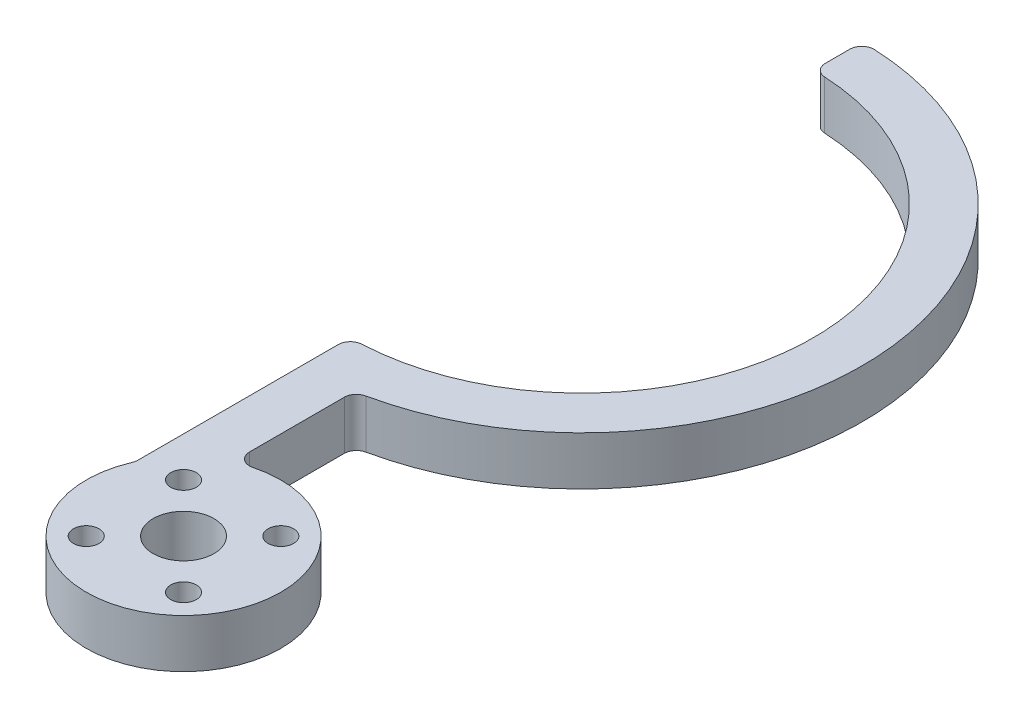
ISO-10303-21;
HEADER;
FILE_DESCRIPTION(('STEP AP214'),'2;1');
FILE_NAME('part.step','',(''),(''),'','','');
FILE_SCHEMA(('AUTOMOTIVE_DESIGN { 1 0 10303 214 1 1 1 1 }'));
ENDSEC;
DATA;
#1=APPLICATION_CONTEXT('core data for automotive mechanical design processes');
#2=APPLICATION_PROTOCOL_DEFINITION('international standard','automotive_design',2000,#1);
#3=PRODUCT_CONTEXT('',#1,'mechanical');
#4=PRODUCT('Part','Part','',(#3));
#5=PRODUCT_RELATED_PRODUCT_CATEGORY('part','',(#4));
#6=PRODUCT_DEFINITION_FORMATION('','',#4);
#7=PRODUCT_DEFINITION_CONTEXT('part definition',#1,'design');
#8=PRODUCT_DEFINITION('design','',#6,#7);
#9=PRODUCT_DEFINITION_SHAPE('','',#8);
#10=(LENGTH_UNIT() NAMED_UNIT(*) SI_UNIT(.MILLI.,.METRE.));
#11=(NAMED_UNIT(*) PLANE_ANGLE_UNIT() SI_UNIT($,.RADIAN.));
#12=(NAMED_UNIT(*) SI_UNIT($,.STERADIAN.) SOLID_ANGLE_UNIT());
#13=UNCERTAINTY_MEASURE_WITH_UNIT(LENGTH_MEASURE(1.E-05),#10,'distance_accuracy_value','');
#14=(GEOMETRIC_REPRESENTATION_CONTEXT(3) GLOBAL_UNCERTAINTY_ASSIGNED_CONTEXT((#13)) GLOBAL_UNIT_ASSIGNED_CONTEXT((#10,
#11,#12)) REPRESENTATION_CONTEXT('',''));
#15=CARTESIAN_POINT('',(0.,0.,0.));
#16=DIRECTION('',(0.,0.,1.));
#17=DIRECTION('',(1.,0.,0.));
#18=AXIS2_PLACEMENT_3D('',#15,#16,#17);
#19=CARTESIAN_POINT('',(0.,8.,0.));
#20=DIRECTION('',(1.,0.,0.));
#21=DIRECTION('',(0.,0.,-1.));
#22=AXIS2_PLACEMENT_3D('',#19,#20,#21);
#23=PLANE('',#22);
#24=DIRECTION('',(0.,0.,1.));
#25=VECTOR('',#24,1.);
#26=CARTESIAN_POINT('',(0.,0.,0.));
#27=LINE('',#26,#25);
#28=CARTESIAN_POINT('',(0.,0.,40.0500936328494));
#29=VERTEX_POINT('',#28);
#30=CARTESIAN_POINT('',(0.,0.,72.9797162674329));
#31=VERTEX_POINT('',#30);
#32=EDGE_CURVE('E220',#29,#31,#27,.T.);
#33=ORIENTED_EDGE('',*,*,#32,.T.);
#34=DIRECTION('',(0.,1.,0.));
#35=VECTOR('',#34,1.);
#36=CARTESIAN_POINT('',(0.,8.,72.9797162674329));
#37=LINE('',#36,#35);
#38=CARTESIAN_POINT('',(0.,8.,72.9797162674329));
#39=VERTEX_POINT('',#38);
#40=EDGE_CURVE('E166',#31,#39,#37,.T.);
#41=ORIENTED_EDGE('',*,*,#40,.T.);
#42=DIRECTION('',(0.,0.,1.));
#43=VECTOR('',#42,1.);
#44=CARTESIAN_POINT('',(0.,8.,0.));
#45=LINE('',#44,#43);
#46=CARTESIAN_POINT('',(0.,8.,40.0500936328494));
#47=VERTEX_POINT('',#46);
#48=EDGE_CURVE('E207',#47,#39,#45,.T.);
#49=ORIENTED_EDGE('',*,*,#48,.F.);
#50=DIRECTION('',(0.,1.,0.));
#51=VECTOR('',#50,1.);
#52=CARTESIAN_POINT('',(0.,0.,40.0500936328494));
#53=LINE('',#52,#51);
#54=EDGE_CURVE('E163',#47,#29,#53,.F.);
#55=ORIENTED_EDGE('',*,*,#54,.T.);
#56=EDGE_LOOP('',(#33,#41,#49,#55));
#57=FACE_BOUND('',#56,.T.);
#58=ADVANCED_FACE('F35',(#57),#23,.F.);
#59=CARTESIAN_POINT('',(14.5597646330328,8.,80.0347992080196));
#60=DIRECTION('',(0.,-1.,0.));
#61=DIRECTION('',(0.,0.,-1.));
#62=AXIS2_PLACEMENT_3D('',#59,#60,#61);
#63=CYLINDRICAL_SURFACE('',#62,16.);
#64=CARTESIAN_POINT('',(14.5597646330328,0.,80.0347992080196));
#65=DIRECTION('',(0.,1.,0.));
#66=DIRECTION('',(0.,0.,1.));
#67=AXIS2_PLACEMENT_3D('',#64,#65,#66);
#68=CIRCLE('',#67,16.);
#69=CARTESIAN_POINT('',(-0.160026151885258,0.,73.7636143719426));
#70=VERTEX_POINT('',#69);
#71=CARTESIAN_POINT('',(10.5066405147814,0.,64.5566796555013));
#72=VERTEX_POINT('',#71);
#73=EDGE_CURVE('E144',#70,#72,#68,.T.);
#74=ORIENTED_EDGE('',*,*,#73,.T.);
#75=DIRECTION('',(0.,-1.,0.));
#76=VECTOR('',#75,1.);
#77=CARTESIAN_POINT('',(10.5066405147814,8.,64.5566796555013));
#78=LINE('',#77,#76);
#79=CARTESIAN_POINT('',(10.5066405147814,8.,64.5566796555013));
#80=VERTEX_POINT('',#79);
#81=EDGE_CURVE('E161',#72,#80,#78,.F.);
#82=ORIENTED_EDGE('',*,*,#81,.T.);
#83=CARTESIAN_POINT('',(14.5597646330328,8.,80.0347992080196));
#84=DIRECTION('',(0.,1.,0.));
#85=DIRECTION('',(0.,0.,1.));
#86=AXIS2_PLACEMENT_3D('',#83,#84,#85);
#87=CIRCLE('',#86,16.);
#88=CARTESIAN_POINT('',(-0.160026151885258,8.,73.7636143719426));
#89=VERTEX_POINT('',#88);
#90=EDGE_CURVE('E204',#89,#80,#87,.T.);
#91=ORIENTED_EDGE('',*,*,#90,.F.);
#92=DIRECTION('',(0.,-1.,0.));
#93=VECTOR('',#92,1.);
#94=CARTESIAN_POINT('',(-0.160026151885258,8.,73.7636143719426));
#95=LINE('',#94,#93);
#96=EDGE_CURVE('E150',#89,#70,#95,.T.);
#97=ORIENTED_EDGE('',*,*,#96,.T.);
#98=EDGE_LOOP('',(#74,#82,#91,#97));
#99=FACE_BOUND('',#98,.T.);
#100=ADVANCED_FACE('F213',(#99),#63,.T.);
#101=CARTESIAN_POINT('',(7.99999999999999,8.,0.));
#102=DIRECTION('',(1.,0.,0.));
#103=DIRECTION('',(0.,0.,-1.));
#104=AXIS2_PLACEMENT_3D('',#101,#102,#103);
#105=PLANE('',#104);
#106=DIRECTION('',(0.,0.,1.));
#107=VECTOR('',#106,1.);
#108=CARTESIAN_POINT('',(7.99999999999999,8.,0.));
#109=LINE('',#108,#107);
#110=CARTESIAN_POINT('',(8.,8.,47.0490169929192));
#111=VERTEX_POINT('',#110);
#112=CARTESIAN_POINT('',(8.,8.,62.6219147114365));
#113=VERTEX_POINT('',#112);
#114=EDGE_CURVE('E216',#111,#113,#109,.T.);
#115=ORIENTED_EDGE('',*,*,#114,.T.);
#116=DIRECTION('',(0.,-1.,0.));
#117=VECTOR('',#116,1.);
#118=CARTESIAN_POINT('',(8.,8.,62.6219147114365));
#119=LINE('',#118,#117);
#120=CARTESIAN_POINT('',(8.,0.,62.6219147114365));
#121=VERTEX_POINT('',#120);
#122=EDGE_CURVE('E143',#113,#121,#119,.T.);
#123=ORIENTED_EDGE('',*,*,#122,.T.);
#124=DIRECTION('',(0.,0.,1.));
#125=VECTOR('',#124,1.);
#126=CARTESIAN_POINT('',(7.99999999999999,0.,0.));
#127=LINE('',#126,#125);
#128=CARTESIAN_POINT('',(8.,0.,47.0490169929192));
#129=VERTEX_POINT('',#128);
#130=EDGE_CURVE('E128',#129,#121,#127,.T.);
#131=ORIENTED_EDGE('',*,*,#130,.F.);
#132=DIRECTION('',(0.,-1.,0.));
#133=VECTOR('',#132,1.);
#134=CARTESIAN_POINT('',(8.,8.,47.0490169929192));
#135=LINE('',#134,#133);
#136=EDGE_CURVE('E140',#129,#111,#135,.F.);
#137=ORIENTED_EDGE('',*,*,#136,.T.);
#138=EDGE_LOOP('',(#115,#123,#131,#137));
#139=FACE_BOUND('',#138,.T.);
#140=ADVANCED_FACE('F139',(#139),#105,.T.);
#141=CARTESIAN_POINT('',(0.,8.,0.));
#142=DIRECTION('',(0.,-1.,0.));
#143=DIRECTION('',(0.,0.,-1.));
#144=AXIS2_PLACEMENT_3D('',#141,#142,#143);
#145=CYLINDRICAL_SURFACE('',#144,46.1);
#146=CARTESIAN_POINT('',(0.,8.,0.));
#147=DIRECTION('',(0.,1.,0.));
#148=DIRECTION('',(0.,0.,1.));
#149=AXIS2_PLACEMENT_3D('',#146,#147,#148);
#150=CIRCLE('',#149,46.1);
#151=CARTESIAN_POINT('',(9.58419958419958,8.,45.0927169100535));
#152=VERTEX_POINT('',#151);
#153=CARTESIAN_POINT('',(2.09070294784575,8.,-46.0525673679966));
#154=VERTEX_POINT('',#153);
#155=EDGE_CURVE('E255',#152,#154,#150,.T.);
#156=ORIENTED_EDGE('',*,*,#155,.F.);
#157=DIRECTION('',(0.,-1.,0.));
#158=VECTOR('',#157,1.);
#159=CARTESIAN_POINT('',(9.58419958419958,8.,45.0927169100535));
#160=LINE('',#159,#158);
#161=CARTESIAN_POINT('',(9.58419958419958,0.,45.0927169100535));
#162=VERTEX_POINT('',#161);
#163=EDGE_CURVE('E186',#152,#162,#160,.T.);
#164=ORIENTED_EDGE('',*,*,#163,.T.);
#165=CARTESIAN_POINT('',(0.,0.,0.));
#166=DIRECTION('',(0.,1.,0.));
#167=DIRECTION('',(0.,0.,1.));
#168=AXIS2_PLACEMENT_3D('',#165,#166,#167);
#169=CIRCLE('',#168,46.1);
#170=CARTESIAN_POINT('',(2.09070294784575,0.,-46.0525673679966));
#171=VERTEX_POINT('',#170);
#172=EDGE_CURVE('E130',#162,#171,#169,.T.);
#173=ORIENTED_EDGE('',*,*,#172,.T.);
#174=DIRECTION('',(0.,-1.,0.));
#175=VECTOR('',#174,1.);
#176=CARTESIAN_POINT('',(2.09070294784575,8.,-46.0525673679967));
#177=LINE('',#176,#175);
#178=EDGE_CURVE('E184',#171,#154,#177,.F.);
#179=ORIENTED_EDGE('',*,*,#178,.T.);
#180=EDGE_LOOP('',(#156,#164,#173,#179));
#181=FACE_BOUND('',#180,.T.);
#182=ADVANCED_FACE('F296',(#181),#145,.T.);
#183=CARTESIAN_POINT('',(0.,8.,0.));
#184=DIRECTION('',(1.,0.,0.));
#185=DIRECTION('',(0.,0.,-1.));
#186=AXIS2_PLACEMENT_3D('',#183,#184,#185);
#187=PLANE('',#186);
#188=DIRECTION('',(0.,0.,1.));
#189=VECTOR('',#188,1.);
#190=CARTESIAN_POINT('',(0.,0.,0.));
#191=LINE('',#190,#189);
#192=CARTESIAN_POINT('',(0.,0.,-44.0546251828341));
#193=VERTEX_POINT('',#192);
#194=CARTESIAN_POINT('',(0.,0.,-40.0500936328494));
#195=VERTEX_POINT('',#194);
#196=EDGE_CURVE('E231',#193,#195,#191,.T.);
#197=ORIENTED_EDGE('',*,*,#196,.T.);
#198=DIRECTION('',(0.,1.,0.));
#199=VECTOR('',#198,1.);
#200=CARTESIAN_POINT('',(0.,8.,-40.0500936328494));
#201=LINE('',#200,#199);
#202=CARTESIAN_POINT('',(0.,8.,-40.0500936328494));
#203=VERTEX_POINT('',#202);
#204=EDGE_CURVE('E50',#195,#203,#201,.T.);
#205=ORIENTED_EDGE('',*,*,#204,.T.);
#206=DIRECTION('',(0.,0.,1.));
#207=VECTOR('',#206,1.);
#208=CARTESIAN_POINT('',(0.,8.,0.));
#209=LINE('',#208,#207);
#210=CARTESIAN_POINT('',(0.,8.,-44.0546251828341));
#211=VERTEX_POINT('',#210);
#212=EDGE_CURVE('E153',#211,#203,#209,.T.);
#213=ORIENTED_EDGE('',*,*,#212,.F.);
#214=DIRECTION('',(0.,-1.,0.));
#215=VECTOR('',#214,1.);
#216=CARTESIAN_POINT('',(0.,8.,-44.0546251828341));
#217=LINE('',#216,#215);
#218=EDGE_CURVE('E188',#211,#193,#217,.T.);
#219=ORIENTED_EDGE('',*,*,#218,.T.);
#220=EDGE_LOOP('',(#197,#205,#213,#219));
#221=FACE_BOUND('',#220,.T.);
#222=ADVANCED_FACE('F284',(#221),#187,.F.);
#223=CARTESIAN_POINT('',(22.5597646330328,8.,72.0347992080196));
#224=DIRECTION('',(0.,-1.,0.));
#225=DIRECTION('',(0.,0.,-1.));
#226=AXIS2_PLACEMENT_3D('',#223,#224,#225);
#227=CYLINDRICAL_SURFACE('',#226,2.1);
#228=CARTESIAN_POINT('',(22.5597646330328,8.,72.0347992080196));
#229=DIRECTION('',(0.,1.,0.));
#230=DIRECTION('',(0.,0.,1.));
#231=AXIS2_PLACEMENT_3D('',#228,#229,#230);
#232=CIRCLE('',#231,2.1);
#233=CARTESIAN_POINT('',(22.5597646330328,8.,74.1347992080196));
#234=VERTEX_POINT('',#233);
#235=EDGE_CURVE('E250',#234,#234,#232,.T.);
#236=ORIENTED_EDGE('',*,*,#235,.T.);
#237=EDGE_LOOP('',(#236));
#238=FACE_BOUND('',#237,.T.);
#239=CARTESIAN_POINT('',(22.5597646330328,0.,72.0347992080196));
#240=DIRECTION('',(0.,1.,0.));
#241=DIRECTION('',(0.,0.,1.));
#242=AXIS2_PLACEMENT_3D('',#239,#240,#241);
#243=CIRCLE('',#242,2.1);
#244=CARTESIAN_POINT('',(22.5597646330328,0.,74.1347992080196));
#245=VERTEX_POINT('',#244);
#246=EDGE_CURVE('E223',#245,#245,#243,.T.);
#247=ORIENTED_EDGE('',*,*,#246,.F.);
#248=EDGE_LOOP('',(#247));
#249=FACE_BOUND('',#248,.T.);
#250=ADVANCED_FACE('F274',(#238,#249),#227,.F.);
#251=CARTESIAN_POINT('',(22.5597646330328,8.,88.0347992080196));
#252=DIRECTION('',(0.,-1.,0.));
#253=DIRECTION('',(0.,0.,-1.));
#254=AXIS2_PLACEMENT_3D('',#251,#252,#253);
#255=CYLINDRICAL_SURFACE('',#254,2.1);
#256=CARTESIAN_POINT('',(22.5597646330328,8.,88.0347992080196));
#257=DIRECTION('',(0.,1.,0.));
#258=DIRECTION('',(0.,0.,1.));
#259=AXIS2_PLACEMENT_3D('',#256,#257,#258);
#260=CIRCLE('',#259,2.1);
#261=CARTESIAN_POINT('',(22.5597646330328,8.,90.1347992080196));
#262=VERTEX_POINT('',#261);
#263=EDGE_CURVE('E247',#262,#262,#260,.T.);
#264=ORIENTED_EDGE('',*,*,#263,.T.);
#265=EDGE_LOOP('',(#264));
#266=FACE_BOUND('',#265,.T.);
#267=CARTESIAN_POINT('',(22.5597646330328,0.,88.0347992080196));
#268=DIRECTION('',(0.,1.,0.));
#269=DIRECTION('',(0.,0.,1.));
#270=AXIS2_PLACEMENT_3D('',#267,#268,#269);
#271=CIRCLE('',#270,2.1);
#272=CARTESIAN_POINT('',(22.5597646330328,0.,90.1347992080196));
#273=VERTEX_POINT('',#272);
#274=EDGE_CURVE('E227',#273,#273,#271,.T.);
#275=ORIENTED_EDGE('',*,*,#274,.F.);
#276=EDGE_LOOP('',(#275));
#277=FACE_BOUND('',#276,.T.);
#278=ADVANCED_FACE('F271',(#266,#277),#255,.F.);
#279=CARTESIAN_POINT('',(6.55976463303278,8.,88.0347992080196));
#280=DIRECTION('',(0.,-1.,0.));
#281=DIRECTION('',(0.,0.,-1.));
#282=AXIS2_PLACEMENT_3D('',#279,#280,#281);
#283=CYLINDRICAL_SURFACE('',#282,2.1);
#284=CARTESIAN_POINT('',(6.55976463303278,8.,88.0347992080196));
#285=DIRECTION('',(0.,1.,0.));
#286=DIRECTION('',(0.,0.,1.));
#287=AXIS2_PLACEMENT_3D('',#284,#285,#286);
#288=CIRCLE('',#287,2.1);
#289=CARTESIAN_POINT('',(6.55976463303278,8.,90.1347992080196));
#290=VERTEX_POINT('',#289);
#291=EDGE_CURVE('E242',#290,#290,#288,.T.);
#292=ORIENTED_EDGE('',*,*,#291,.T.);
#293=EDGE_LOOP('',(#292));
#294=FACE_BOUND('',#293,.T.);
#295=CARTESIAN_POINT('',(6.55976463303278,0.,88.0347992080196));
#296=DIRECTION('',(0.,1.,0.));
#297=DIRECTION('',(0.,0.,1.));
#298=AXIS2_PLACEMENT_3D('',#295,#296,#297);
#299=CIRCLE('',#298,2.1);
#300=CARTESIAN_POINT('',(6.55976463303278,0.,90.1347992080196));
#301=VERTEX_POINT('',#300);
#302=EDGE_CURVE('E264',#301,#301,#299,.T.);
#303=ORIENTED_EDGE('',*,*,#302,.F.);
#304=EDGE_LOOP('',(#303));
#305=FACE_BOUND('',#304,.T.);
#306=ADVANCED_FACE('F273',(#294,#305),#283,.F.);
#307=CARTESIAN_POINT('',(6.55976463303277,8.,72.0347992080196));
#308=DIRECTION('',(0.,-1.,0.));
#309=DIRECTION('',(0.,0.,-1.));
#310=AXIS2_PLACEMENT_3D('',#307,#308,#309);
#311=CYLINDRICAL_SURFACE('',#310,2.1);
#312=CARTESIAN_POINT('',(6.55976463303277,8.,72.0347992080196));
#313=DIRECTION('',(0.,1.,0.));
#314=DIRECTION('',(0.,0.,1.));
#315=AXIS2_PLACEMENT_3D('',#312,#313,#314);
#316=CIRCLE('',#315,2.1);
#317=CARTESIAN_POINT('',(6.55976463303277,8.,74.1347992080196));
#318=VERTEX_POINT('',#317);
#319=EDGE_CURVE('E237',#318,#318,#316,.T.);
#320=ORIENTED_EDGE('',*,*,#319,.T.);
#321=EDGE_LOOP('',(#320));
#322=FACE_BOUND('',#321,.T.);
#323=CARTESIAN_POINT('',(6.55976463303277,0.,72.0347992080196));
#324=DIRECTION('',(0.,1.,0.));
#325=DIRECTION('',(0.,0.,1.));
#326=AXIS2_PLACEMENT_3D('',#323,#324,#325);
#327=CIRCLE('',#326,2.1);
#328=CARTESIAN_POINT('',(6.55976463303277,0.,74.1347992080196));
#329=VERTEX_POINT('',#328);
#330=EDGE_CURVE('E261',#329,#329,#327,.T.);
#331=ORIENTED_EDGE('',*,*,#330,.F.);
#332=EDGE_LOOP('',(#331));
#333=FACE_BOUND('',#332,.T.);
#334=ADVANCED_FACE('F281',(#322,#333),#311,.F.);
#335=CARTESIAN_POINT('',(14.5597646330328,8.,80.0347992080196));
#336=DIRECTION('',(0.,-1.,0.));
#337=DIRECTION('',(0.,0.,-1.));
#338=AXIS2_PLACEMENT_3D('',#335,#336,#337);
#339=CYLINDRICAL_SURFACE('',#338,5.);
#340=CARTESIAN_POINT('',(14.5597646330328,8.,80.0347992080196));
#341=DIRECTION('',(0.,1.,0.));
#342=DIRECTION('',(0.,0.,1.));
#343=AXIS2_PLACEMENT_3D('',#340,#341,#342);
#344=CIRCLE('',#343,5.);
#345=CARTESIAN_POINT('',(14.5597646330328,8.,85.0347992080196));
#346=VERTEX_POINT('',#345);
#347=EDGE_CURVE('E234',#346,#346,#344,.T.);
#348=ORIENTED_EDGE('',*,*,#347,.T.);
#349=EDGE_LOOP('',(#348));
#350=FACE_BOUND('',#349,.T.);
#351=CARTESIAN_POINT('',(14.5597646330328,0.,80.0347992080196));
#352=DIRECTION('',(0.,1.,0.));
#353=DIRECTION('',(0.,0.,1.));
#354=AXIS2_PLACEMENT_3D('',#351,#352,#353);
#355=CIRCLE('',#354,5.);
#356=CARTESIAN_POINT('',(14.5597646330328,0.,85.0347992080196));
#357=VERTEX_POINT('',#356);
#358=EDGE_CURVE('E258',#357,#357,#355,.T.);
#359=ORIENTED_EDGE('',*,*,#358,.F.);
#360=EDGE_LOOP('',(#359));
#361=FACE_BOUND('',#360,.T.);
#362=ADVANCED_FACE('F305',(#350,#361),#339,.F.);
#363=CARTESIAN_POINT('',(0.,8.,0.));
#364=DIRECTION('',(0.,-1.,0.));
#365=DIRECTION('',(0.,0.,-1.));
#366=AXIS2_PLACEMENT_3D('',#363,#364,#365);
#367=CYLINDRICAL_SURFACE('',#366,38.1);
#368=CARTESIAN_POINT('',(0.,0.,0.));
#369=DIRECTION('',(0.,1.,0.));
#370=DIRECTION('',(0.,0.,1.));
#371=AXIS2_PLACEMENT_3D('',#368,#369,#370);
#372=CIRCLE('',#371,38.1);
#373=CARTESIAN_POINT('',(1.9002493765586,0.,38.0525827284678));
#374=VERTEX_POINT('',#373);
#375=CARTESIAN_POINT('',(1.90024937655855,0.,-38.0525827284678));
#376=VERTEX_POINT('',#375);
#377=EDGE_CURVE('E156',#374,#376,#372,.T.);
#378=ORIENTED_EDGE('',*,*,#377,.F.);
#379=DIRECTION('',(0.,-1.,0.));
#380=VECTOR('',#379,1.);
#381=CARTESIAN_POINT('',(1.9002493765586,8.,38.0525827284678));
#382=LINE('',#381,#380);
#383=CARTESIAN_POINT('',(1.9002493765586,8.,38.0525827284678));
#384=VERTEX_POINT('',#383);
#385=EDGE_CURVE('E177',#374,#384,#382,.F.);
#386=ORIENTED_EDGE('',*,*,#385,.T.);
#387=CARTESIAN_POINT('',(0.,8.,0.));
#388=DIRECTION('',(0.,1.,0.));
#389=DIRECTION('',(0.,0.,1.));
#390=AXIS2_PLACEMENT_3D('',#387,#388,#389);
#391=CIRCLE('',#390,38.1);
#392=CARTESIAN_POINT('',(1.90024937655855,8.,-38.0525827284678));
#393=VERTEX_POINT('',#392);
#394=EDGE_CURVE('E148',#384,#393,#391,.T.);
#395=ORIENTED_EDGE('',*,*,#394,.T.);
#396=DIRECTION('',(0.,-1.,0.));
#397=VECTOR('',#396,1.);
#398=CARTESIAN_POINT('',(1.90024937655855,8.,-38.0525827284678));
#399=LINE('',#398,#397);
#400=EDGE_CURVE('E174',#393,#376,#399,.T.);
#401=ORIENTED_EDGE('',*,*,#400,.T.);
#402=EDGE_LOOP('',(#378,#386,#395,#401));
#403=FACE_BOUND('',#402,.T.);
#404=ADVANCED_FACE('F302',(#403),#367,.F.);
#405=CARTESIAN_POINT('',(0.,8.,0.));
#406=DIRECTION('',(0.,1.,0.));
#407=DIRECTION('',(0.,0.,1.));
#408=AXIS2_PLACEMENT_3D('',#405,#406,#407);
#409=PLANE('',#408);
#410=ORIENTED_EDGE('',*,*,#347,.F.);
#411=EDGE_LOOP('',(#410));
#412=FACE_BOUND('',#411,.T.);
#413=ORIENTED_EDGE('',*,*,#319,.F.);
#414=EDGE_LOOP('',(#413));
#415=FACE_BOUND('',#414,.T.);
#416=ORIENTED_EDGE('',*,*,#291,.F.);
#417=EDGE_LOOP('',(#416));
#418=FACE_BOUND('',#417,.T.);
#419=ORIENTED_EDGE('',*,*,#263,.F.);
#420=EDGE_LOOP('',(#419));
#421=FACE_BOUND('',#420,.T.);
#422=ORIENTED_EDGE('',*,*,#235,.F.);
#423=EDGE_LOOP('',(#422));
#424=FACE_BOUND('',#423,.T.);
#425=ORIENTED_EDGE('',*,*,#394,.F.);
#426=CARTESIAN_POINT('',(1.99999999999999,8.,40.0500936328494));
#427=DIRECTION('',(0.,1.,0.));
#428=DIRECTION('',(0.,0.,1.));
#429=AXIS2_PLACEMENT_3D('',#426,#427,#428);
#430=CIRCLE('',#429,2.);
#431=EDGE_CURVE('E182',#384,#47,#430,.T.);
#432=ORIENTED_EDGE('',*,*,#431,.T.);
#433=ORIENTED_EDGE('',*,*,#48,.T.);
#434=CARTESIAN_POINT('',(-2.00000000000001,8.,72.9797162674329));
#435=DIRECTION('',(0.,1.,0.));
#436=DIRECTION('',(0.,0.,1.));
#437=AXIS2_PLACEMENT_3D('',#434,#435,#436);
#438=CIRCLE('',#437,2.);
#439=EDGE_CURVE('E135',#39,#89,#438,.F.);
#440=ORIENTED_EDGE('',*,*,#439,.T.);
#441=ORIENTED_EDGE('',*,*,#90,.T.);
#442=CARTESIAN_POINT('',(10.,8.,62.6219147114365));
#443=DIRECTION('',(0.,1.,0.));
#444=DIRECTION('',(0.,0.,1.));
#445=AXIS2_PLACEMENT_3D('',#442,#443,#444);
#446=CIRCLE('',#445,2.);
#447=EDGE_CURVE('E194',#80,#113,#446,.F.);
#448=ORIENTED_EDGE('',*,*,#447,.T.);
#449=ORIENTED_EDGE('',*,*,#114,.F.);
#450=CARTESIAN_POINT('',(10.,8.,47.0490169929192));
#451=DIRECTION('',(0.,1.,0.));
#452=DIRECTION('',(0.,0.,1.));
#453=AXIS2_PLACEMENT_3D('',#450,#451,#452);
#454=CIRCLE('',#453,2.);
#455=EDGE_CURVE('E11',#111,#152,#454,.F.);
#456=ORIENTED_EDGE('',*,*,#455,.T.);
#457=ORIENTED_EDGE('',*,*,#155,.T.);
#458=CARTESIAN_POINT('',(1.99999999999994,8.,-44.0546251828341));
#459=DIRECTION('',(0.,1.,0.));
#460=DIRECTION('',(0.,0.,1.));
#461=AXIS2_PLACEMENT_3D('',#458,#459,#460);
#462=CIRCLE('',#461,2.);
#463=EDGE_CURVE('E57',#154,#211,#462,.T.);
#464=ORIENTED_EDGE('',*,*,#463,.T.);
#465=ORIENTED_EDGE('',*,*,#212,.T.);
#466=CARTESIAN_POINT('',(1.99999999999995,8.,-40.0500936328494));
#467=DIRECTION('',(0.,1.,0.));
#468=DIRECTION('',(0.,0.,1.));
#469=AXIS2_PLACEMENT_3D('',#466,#467,#468);
#470=CIRCLE('',#469,2.);
#471=EDGE_CURVE('E180',#203,#393,#470,.T.);
#472=ORIENTED_EDGE('',*,*,#471,.T.);
#473=EDGE_LOOP('',(#425,#432,#433,#440,#441,#448,#449,#456,#457,#464,#465,#472));
#474=FACE_BOUND('',#473,.T.);
#475=ADVANCED_FACE('F203',(#412,#415,#418,#421,#424,#474),#409,.T.);
#476=CARTESIAN_POINT('',(0.,0.,0.));
#477=DIRECTION('',(0.,1.,0.));
#478=DIRECTION('',(0.,0.,1.));
#479=AXIS2_PLACEMENT_3D('',#476,#477,#478);
#480=PLANE('',#479);
#481=ORIENTED_EDGE('',*,*,#358,.T.);
#482=EDGE_LOOP('',(#481));
#483=FACE_BOUND('',#482,.T.);
#484=ORIENTED_EDGE('',*,*,#330,.T.);
#485=EDGE_LOOP('',(#484));
#486=FACE_BOUND('',#485,.T.);
#487=ORIENTED_EDGE('',*,*,#302,.T.);
#488=EDGE_LOOP('',(#487));
#489=FACE_BOUND('',#488,.T.);
#490=ORIENTED_EDGE('',*,*,#274,.T.);
#491=EDGE_LOOP('',(#490));
#492=FACE_BOUND('',#491,.T.);
#493=ORIENTED_EDGE('',*,*,#246,.T.);
#494=EDGE_LOOP('',(#493));
#495=FACE_BOUND('',#494,.T.);
#496=ORIENTED_EDGE('',*,*,#32,.F.);
#497=CARTESIAN_POINT('',(1.99999999999999,0.,40.0500936328494));
#498=DIRECTION('',(0.,1.,0.));
#499=DIRECTION('',(0.,0.,1.));
#500=AXIS2_PLACEMENT_3D('',#497,#498,#499);
#501=CIRCLE('',#500,2.);
#502=EDGE_CURVE('E172',#29,#374,#501,.F.);
#503=ORIENTED_EDGE('',*,*,#502,.T.);
#504=ORIENTED_EDGE('',*,*,#377,.T.);
#505=CARTESIAN_POINT('',(1.99999999999995,0.,-40.0500936328494));
#506=DIRECTION('',(0.,1.,0.));
#507=DIRECTION('',(0.,0.,1.));
#508=AXIS2_PLACEMENT_3D('',#505,#506,#507);
#509=CIRCLE('',#508,2.);
#510=EDGE_CURVE('E170',#376,#195,#509,.F.);
#511=ORIENTED_EDGE('',*,*,#510,.T.);
#512=ORIENTED_EDGE('',*,*,#196,.F.);
#513=CARTESIAN_POINT('',(1.99999999999994,0.,-44.0546251828341));
#514=DIRECTION('',(0.,1.,0.));
#515=DIRECTION('',(0.,0.,1.));
#516=AXIS2_PLACEMENT_3D('',#513,#514,#515);
#517=CIRCLE('',#516,2.);
#518=EDGE_CURVE('E168',#193,#171,#517,.F.);
#519=ORIENTED_EDGE('',*,*,#518,.T.);
#520=ORIENTED_EDGE('',*,*,#172,.F.);
#521=CARTESIAN_POINT('',(10.,0.,47.0490169929192));
#522=DIRECTION('',(0.,1.,0.));
#523=DIRECTION('',(0.,0.,1.));
#524=AXIS2_PLACEMENT_3D('',#521,#522,#523);
#525=CIRCLE('',#524,2.);
#526=EDGE_CURVE('E43',#162,#129,#525,.T.);
#527=ORIENTED_EDGE('',*,*,#526,.T.);
#528=ORIENTED_EDGE('',*,*,#130,.T.);
#529=CARTESIAN_POINT('',(10.,0.,62.6219147114365));
#530=DIRECTION('',(0.,1.,0.));
#531=DIRECTION('',(0.,0.,1.));
#532=AXIS2_PLACEMENT_3D('',#529,#530,#531);
#533=CIRCLE('',#532,2.);
#534=EDGE_CURVE('E192',#121,#72,#533,.T.);
#535=ORIENTED_EDGE('',*,*,#534,.T.);
#536=ORIENTED_EDGE('',*,*,#73,.F.);
#537=CARTESIAN_POINT('',(-2.00000000000001,0.,72.9797162674329));
#538=DIRECTION('',(0.,1.,0.));
#539=DIRECTION('',(0.,0.,1.));
#540=AXIS2_PLACEMENT_3D('',#537,#538,#539);
#541=CIRCLE('',#540,2.);
#542=EDGE_CURVE('E196',#70,#31,#541,.T.);
#543=ORIENTED_EDGE('',*,*,#542,.T.);
#544=EDGE_LOOP('',(#496,#503,#504,#511,#512,#519,#520,#527,#528,#535,#536,#543));
#545=FACE_BOUND('',#544,.T.);
#546=ADVANCED_FACE('F127',(#483,#486,#489,#492,#495,#545),#480,.F.);
#547=CARTESIAN_POINT('',(10.,8.,62.6219147114365));
#548=DIRECTION('',(0.,-1.,0.));
#549=DIRECTION('',(0.,0.,-1.));
#550=AXIS2_PLACEMENT_3D('',#547,#548,#549);
#551=CYLINDRICAL_SURFACE('',#550,2.);
#552=ORIENTED_EDGE('',*,*,#447,.F.);
#553=ORIENTED_EDGE('',*,*,#81,.F.);
#554=ORIENTED_EDGE('',*,*,#534,.F.);
#555=ORIENTED_EDGE('',*,*,#122,.F.);
#556=EDGE_LOOP('',(#552,#553,#554,#555));
#557=FACE_BOUND('',#556,.T.);
#558=ADVANCED_FACE('F309',(#557),#551,.F.);
#559=CARTESIAN_POINT('',(-2.00000000000001,8.,72.9797162674329));
#560=DIRECTION('',(0.,-1.,0.));
#561=DIRECTION('',(0.,0.,-1.));
#562=AXIS2_PLACEMENT_3D('',#559,#560,#561);
#563=CYLINDRICAL_SURFACE('',#562,2.);
#564=ORIENTED_EDGE('',*,*,#439,.F.);
#565=ORIENTED_EDGE('',*,*,#40,.F.);
#566=ORIENTED_EDGE('',*,*,#542,.F.);
#567=ORIENTED_EDGE('',*,*,#96,.F.);
#568=EDGE_LOOP('',(#564,#565,#566,#567));
#569=FACE_BOUND('',#568,.T.);
#570=ADVANCED_FACE('F218',(#569),#563,.F.);
#571=CARTESIAN_POINT('',(1.99999999999999,8.,40.0500936328494));
#572=DIRECTION('',(0.,-1.,0.));
#573=DIRECTION('',(0.,0.,-1.));
#574=AXIS2_PLACEMENT_3D('',#571,#572,#573);
#575=CYLINDRICAL_SURFACE('',#574,2.);
#576=ORIENTED_EDGE('',*,*,#431,.F.);
#577=ORIENTED_EDGE('',*,*,#385,.F.);
#578=ORIENTED_EDGE('',*,*,#502,.F.);
#579=ORIENTED_EDGE('',*,*,#54,.F.);
#580=EDGE_LOOP('',(#576,#577,#578,#579));
#581=FACE_BOUND('',#580,.T.);
#582=ADVANCED_FACE('F344',(#581),#575,.T.);
#583=CARTESIAN_POINT('',(10.,8.,47.0490169929192));
#584=DIRECTION('',(0.,-1.,0.));
#585=DIRECTION('',(0.,0.,-1.));
#586=AXIS2_PLACEMENT_3D('',#583,#584,#585);
#587=CYLINDRICAL_SURFACE('',#586,2.);
#588=ORIENTED_EDGE('',*,*,#455,.F.);
#589=ORIENTED_EDGE('',*,*,#136,.F.);
#590=ORIENTED_EDGE('',*,*,#526,.F.);
#591=ORIENTED_EDGE('',*,*,#163,.F.);
#592=EDGE_LOOP('',(#588,#589,#590,#591));
#593=FACE_BOUND('',#592,.T.);
#594=ADVANCED_FACE('F147',(#593),#587,.F.);
#595=CARTESIAN_POINT('',(1.99999999999995,8.,-40.0500936328494));
#596=DIRECTION('',(0.,-1.,0.));
#597=DIRECTION('',(0.,0.,-1.));
#598=AXIS2_PLACEMENT_3D('',#595,#596,#597);
#599=CYLINDRICAL_SURFACE('',#598,2.);
#600=ORIENTED_EDGE('',*,*,#471,.F.);
#601=ORIENTED_EDGE('',*,*,#204,.F.);
#602=ORIENTED_EDGE('',*,*,#510,.F.);
#603=ORIENTED_EDGE('',*,*,#400,.F.);
#604=EDGE_LOOP('',(#600,#601,#602,#603));
#605=FACE_BOUND('',#604,.T.);
#606=ADVANCED_FACE('F349',(#605),#599,.T.);
#607=CARTESIAN_POINT('',(1.99999999999994,8.,-44.0546251828341));
#608=DIRECTION('',(0.,-1.,0.));
#609=DIRECTION('',(0.,0.,-1.));
#610=AXIS2_PLACEMENT_3D('',#607,#608,#609);
#611=CYLINDRICAL_SURFACE('',#610,2.);
#612=ORIENTED_EDGE('',*,*,#463,.F.);
#613=ORIENTED_EDGE('',*,*,#178,.F.);
#614=ORIENTED_EDGE('',*,*,#518,.F.);
#615=ORIENTED_EDGE('',*,*,#218,.F.);
#616=EDGE_LOOP('',(#612,#613,#614,#615));
#617=FACE_BOUND('',#616,.T.);
#618=ADVANCED_FACE('F37',(#617),#611,.T.);
#619=CLOSED_SHELL('',(#58,#100,#140,#182,#222,#250,#278,#306,#334,#362,#404,#475,#546,#558,#570,
#582,#594,#606,#618));
#620=MANIFOLD_SOLID_BREP('B2',#619);
#621=ADVANCED_BREP_SHAPE_REPRESENTATION('',(#18,#620),#14);
#622=SHAPE_DEFINITION_REPRESENTATION(#9,#621);
ENDSEC;
END-ISO-10303-21;
